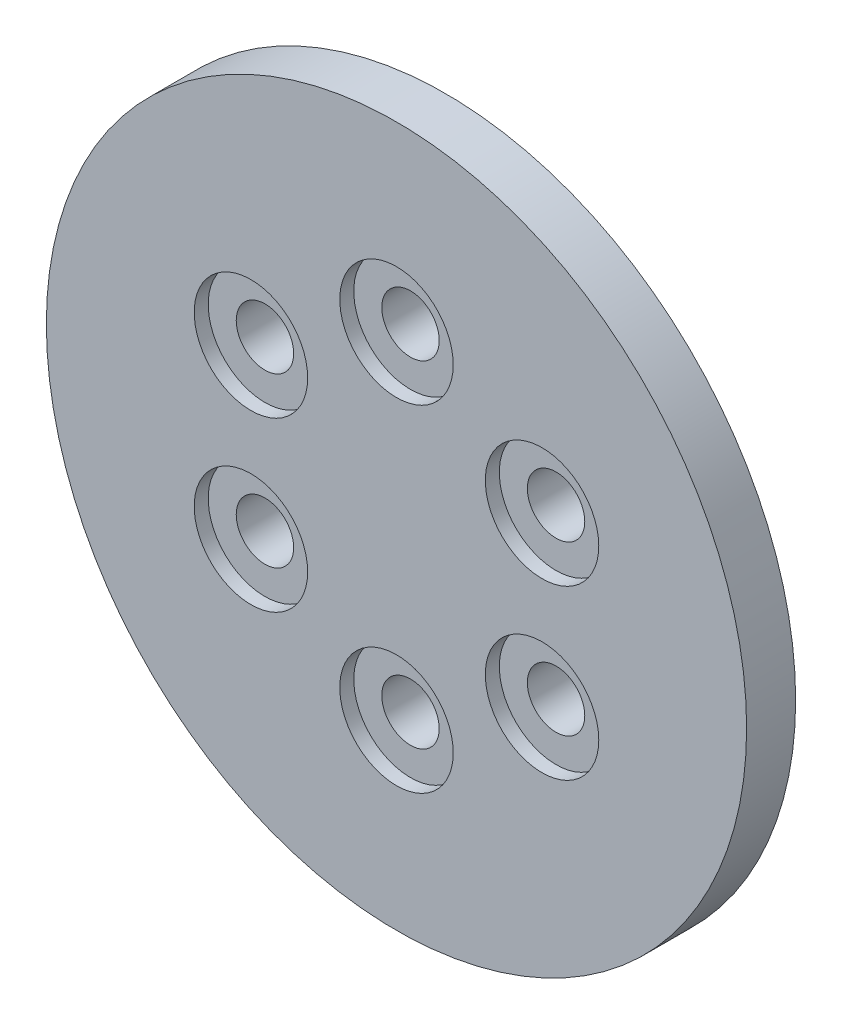
ISO-10303-21;
HEADER;
FILE_DESCRIPTION(('STEP AP214'),'2;1');
FILE_NAME('part.step','',(''),(''),'','','');
FILE_SCHEMA(('AUTOMOTIVE_DESIGN { 1 0 10303 214 1 1 1 1 }'));
ENDSEC;
DATA;
#1=APPLICATION_CONTEXT('core data for automotive mechanical design processes');
#2=APPLICATION_PROTOCOL_DEFINITION('international standard','automotive_design',2000,#1);
#3=PRODUCT_CONTEXT('',#1,'mechanical');
#4=PRODUCT('Part','Part','',(#3));
#5=PRODUCT_RELATED_PRODUCT_CATEGORY('part','',(#4));
#6=PRODUCT_DEFINITION_FORMATION('','',#4);
#7=PRODUCT_DEFINITION_CONTEXT('part definition',#1,'design');
#8=PRODUCT_DEFINITION('design','',#6,#7);
#9=PRODUCT_DEFINITION_SHAPE('','',#8);
#10=(LENGTH_UNIT() NAMED_UNIT(*) SI_UNIT(.MILLI.,.METRE.));
#11=(NAMED_UNIT(*) PLANE_ANGLE_UNIT() SI_UNIT($,.RADIAN.));
#12=(NAMED_UNIT(*) SI_UNIT($,.STERADIAN.) SOLID_ANGLE_UNIT());
#13=UNCERTAINTY_MEASURE_WITH_UNIT(LENGTH_MEASURE(1.E-05),#10,'distance_accuracy_value','');
#14=(GEOMETRIC_REPRESENTATION_CONTEXT(3) GLOBAL_UNCERTAINTY_ASSIGNED_CONTEXT((#13)) GLOBAL_UNIT_ASSIGNED_CONTEXT((#10,
#11,#12)) REPRESENTATION_CONTEXT('',''));
#15=CARTESIAN_POINT('',(0.,0.,0.));
#16=DIRECTION('',(0.,0.,1.));
#17=DIRECTION('',(1.,0.,0.));
#18=AXIS2_PLACEMENT_3D('',#15,#16,#17);
#19=CARTESIAN_POINT('',(0.,0.,4.));
#20=DIRECTION('',(0.,0.,-1.));
#21=DIRECTION('',(-1.,0.,0.));
#22=AXIS2_PLACEMENT_3D('',#19,#20,#21);
#23=CYLINDRICAL_SURFACE('',#22,25.);
#24=CARTESIAN_POINT('',(0.,0.,4.));
#25=DIRECTION('',(0.,0.,1.));
#26=DIRECTION('',(1.,0.,0.));
#27=AXIS2_PLACEMENT_3D('',#24,#25,#26);
#28=CIRCLE('',#27,25.);
#29=CARTESIAN_POINT('',(25.,0.,4.));
#30=VERTEX_POINT('',#29);
#31=EDGE_CURVE('E10',#30,#30,#28,.T.);
#32=ORIENTED_EDGE('',*,*,#31,.F.);
#33=EDGE_LOOP('',(#32));
#34=FACE_BOUND('',#33,.T.);
#35=CARTESIAN_POINT('',(0.,0.,0.5));
#36=DIRECTION('',(0.,0.,-1.));
#37=DIRECTION('',(-1.,0.,0.));
#38=AXIS2_PLACEMENT_3D('',#35,#36,#37);
#39=CIRCLE('',#38,25.);
#40=CARTESIAN_POINT('',(-25.,0.,0.5));
#41=VERTEX_POINT('',#40);
#42=EDGE_CURVE('E120',#41,#41,#39,.T.);
#43=ORIENTED_EDGE('',*,*,#42,.F.);
#44=EDGE_LOOP('',(#43));
#45=FACE_BOUND('',#44,.T.);
#46=ADVANCED_FACE('F38',(#34,#45),#23,.T.);
#47=CARTESIAN_POINT('',(0.,0.,0.));
#48=DIRECTION('',(0.,0.,1.));
#49=DIRECTION('',(1.,0.,0.));
#50=AXIS2_PLACEMENT_3D('',#47,#48,#49);
#51=PLANE('',#50);
#52=CARTESIAN_POINT('',(10.3923048454122,-6.00000000000059,0.));
#53=DIRECTION('',(0.,0.,-1.));
#54=DIRECTION('',(-1.,0.,0.));
#55=AXIS2_PLACEMENT_3D('',#52,#53,#54);
#56=CIRCLE('',#55,2.05000000000126);
#57=CARTESIAN_POINT('',(8.34230484541099,-6.00000000000059,0.));
#58=VERTEX_POINT('',#57);
#59=EDGE_CURVE('E44',#58,#58,#56,.T.);
#60=ORIENTED_EDGE('',*,*,#59,.F.);
#61=EDGE_LOOP('',(#60));
#62=FACE_BOUND('',#61,.T.);
#63=CARTESIAN_POINT('',(10.3923048454129,5.9999999999994,0.));
#64=DIRECTION('',(0.,0.,-1.));
#65=DIRECTION('',(-1.,0.,0.));
#66=AXIS2_PLACEMENT_3D('',#63,#64,#65);
#67=CIRCLE('',#66,2.05000000000064);
#68=CARTESIAN_POINT('',(8.34230484541229,5.9999999999994,0.));
#69=VERTEX_POINT('',#68);
#70=EDGE_CURVE('E48',#69,#69,#67,.T.);
#71=ORIENTED_EDGE('',*,*,#70,.F.);
#72=EDGE_LOOP('',(#71));
#73=FACE_BOUND('',#72,.T.);
#74=CARTESIAN_POINT('',(0.,12.,0.));
#75=DIRECTION('',(0.,0.,-1.));
#76=DIRECTION('',(-1.,0.,0.));
#77=AXIS2_PLACEMENT_3D('',#74,#75,#76);
#78=CIRCLE('',#77,2.05);
#79=CARTESIAN_POINT('',(-2.05,12.,0.));
#80=VERTEX_POINT('',#79);
#81=EDGE_CURVE('E52',#80,#80,#78,.T.);
#82=ORIENTED_EDGE('',*,*,#81,.F.);
#83=EDGE_LOOP('',(#82));
#84=FACE_BOUND('',#83,.T.);
#85=CARTESIAN_POINT('',(-10.3923048454136,6.00000000000059,0.));
#86=DIRECTION('',(0.,0.,-1.));
#87=DIRECTION('',(-1.,0.,0.));
#88=AXIS2_PLACEMENT_3D('',#85,#86,#87);
#89=CIRCLE('',#88,2.05000000000019);
#90=CARTESIAN_POINT('',(-12.4423048454138,6.00000000000059,0.));
#91=VERTEX_POINT('',#90);
#92=EDGE_CURVE('E62',#91,#91,#89,.T.);
#93=ORIENTED_EDGE('',*,*,#92,.F.);
#94=EDGE_LOOP('',(#93));
#95=FACE_BOUND('',#94,.T.);
#96=CARTESIAN_POINT('',(-10.3923048454143,-5.99999999999941,0.));
#97=DIRECTION('',(0.,0.,-1.));
#98=DIRECTION('',(-1.,0.,0.));
#99=AXIS2_PLACEMENT_3D('',#96,#97,#98);
#100=CIRCLE('',#99,2.05000000000086);
#101=CARTESIAN_POINT('',(-12.4423048454151,-5.99999999999941,0.));
#102=VERTEX_POINT('',#101);
#103=EDGE_CURVE('E58',#102,#102,#100,.T.);
#104=ORIENTED_EDGE('',*,*,#103,.F.);
#105=EDGE_LOOP('',(#104));
#106=FACE_BOUND('',#105,.T.);
#107=CARTESIAN_POINT('',(-1.35983332418246E-12,-12.,0.));
#108=DIRECTION('',(0.,0.,-1.));
#109=DIRECTION('',(-1.,0.,0.));
#110=AXIS2_PLACEMENT_3D('',#107,#108,#109);
#111=CIRCLE('',#110,2.05000000000138);
#112=CARTESIAN_POINT('',(-2.05000000000274,-12.,0.));
#113=VERTEX_POINT('',#112);
#114=EDGE_CURVE('E55',#113,#113,#111,.T.);
#115=ORIENTED_EDGE('',*,*,#114,.F.);
#116=EDGE_LOOP('',(#115));
#117=FACE_BOUND('',#116,.T.);
#118=CARTESIAN_POINT('',(0.,0.,0.));
#119=DIRECTION('',(0.,0.,-1.));
#120=DIRECTION('',(-1.,0.,0.));
#121=AXIS2_PLACEMENT_3D('',#118,#119,#120);
#122=CIRCLE('',#121,20.);
#123=CARTESIAN_POINT('',(-20.,0.,0.));
#124=VERTEX_POINT('',#123);
#125=EDGE_CURVE('E124',#124,#124,#122,.T.);
#126=ORIENTED_EDGE('',*,*,#125,.T.);
#127=EDGE_LOOP('',(#126));
#128=FACE_BOUND('',#127,.T.);
#129=ADVANCED_FACE('F141',(#62,#73,#84,#95,#106,#117,#128),#51,.F.);
#130=CARTESIAN_POINT('',(10.3923048454122,-6.00000000000059,10.));
#131=DIRECTION('',(0.,0.,-1.));
#132=DIRECTION('',(-1.,0.,0.));
#133=AXIS2_PLACEMENT_3D('',#130,#131,#132);
#134=CYLINDRICAL_SURFACE('',#133,2.05000000000126);
#135=ORIENTED_EDGE('',*,*,#59,.T.);
#136=EDGE_LOOP('',(#135));
#137=FACE_BOUND('',#136,.T.);
#138=CARTESIAN_POINT('',(10.3923048454122,-6.00000000000059,3.));
#139=DIRECTION('',(0.,0.,1.));
#140=DIRECTION('',(1.,0.,0.));
#141=AXIS2_PLACEMENT_3D('',#138,#139,#140);
#142=CIRCLE('',#141,2.05000000000126);
#143=CARTESIAN_POINT('',(12.4423048454135,-6.00000000000059,3.));
#144=VERTEX_POINT('',#143);
#145=EDGE_CURVE('E83',#144,#144,#142,.T.);
#146=ORIENTED_EDGE('',*,*,#145,.T.);
#147=EDGE_LOOP('',(#146));
#148=FACE_BOUND('',#147,.T.);
#149=ADVANCED_FACE('F146',(#137,#148),#134,.F.);
#150=CARTESIAN_POINT('',(10.3923048454129,5.9999999999994,10.));
#151=DIRECTION('',(0.,0.,-1.));
#152=DIRECTION('',(-1.,0.,0.));
#153=AXIS2_PLACEMENT_3D('',#150,#151,#152);
#154=CYLINDRICAL_SURFACE('',#153,2.05000000000064);
#155=ORIENTED_EDGE('',*,*,#70,.T.);
#156=EDGE_LOOP('',(#155));
#157=FACE_BOUND('',#156,.T.);
#158=CARTESIAN_POINT('',(10.3923048454129,5.9999999999994,3.));
#159=DIRECTION('',(0.,0.,1.));
#160=DIRECTION('',(1.,0.,0.));
#161=AXIS2_PLACEMENT_3D('',#158,#159,#160);
#162=CIRCLE('',#161,2.05000000000064);
#163=CARTESIAN_POINT('',(12.4423048454136,5.9999999999994,3.));
#164=VERTEX_POINT('',#163);
#165=EDGE_CURVE('E80',#164,#164,#162,.T.);
#166=ORIENTED_EDGE('',*,*,#165,.T.);
#167=EDGE_LOOP('',(#166));
#168=FACE_BOUND('',#167,.T.);
#169=ADVANCED_FACE('F151',(#157,#168),#154,.F.);
#170=CARTESIAN_POINT('',(0.,12.,10.));
#171=DIRECTION('',(0.,0.,-1.));
#172=DIRECTION('',(-1.,0.,0.));
#173=AXIS2_PLACEMENT_3D('',#170,#171,#172);
#174=CYLINDRICAL_SURFACE('',#173,2.05);
#175=ORIENTED_EDGE('',*,*,#81,.T.);
#176=EDGE_LOOP('',(#175));
#177=FACE_BOUND('',#176,.T.);
#178=CARTESIAN_POINT('',(0.,12.,3.));
#179=DIRECTION('',(0.,0.,1.));
#180=DIRECTION('',(1.,0.,0.));
#181=AXIS2_PLACEMENT_3D('',#178,#179,#180);
#182=CIRCLE('',#181,2.05);
#183=CARTESIAN_POINT('',(2.05,12.,3.));
#184=VERTEX_POINT('',#183);
#185=EDGE_CURVE('E115',#184,#184,#182,.T.);
#186=ORIENTED_EDGE('',*,*,#185,.T.);
#187=EDGE_LOOP('',(#186));
#188=FACE_BOUND('',#187,.T.);
#189=ADVANCED_FACE('F171',(#177,#188),#174,.F.);
#190=CARTESIAN_POINT('',(-10.3923048454136,6.00000000000059,10.));
#191=DIRECTION('',(0.,0.,-1.));
#192=DIRECTION('',(-1.,0.,0.));
#193=AXIS2_PLACEMENT_3D('',#190,#191,#192);
#194=CYLINDRICAL_SURFACE('',#193,2.05000000000019);
#195=ORIENTED_EDGE('',*,*,#92,.T.);
#196=EDGE_LOOP('',(#195));
#197=FACE_BOUND('',#196,.T.);
#198=CARTESIAN_POINT('',(-10.3923048454136,6.00000000000059,3.));
#199=DIRECTION('',(0.,0.,1.));
#200=DIRECTION('',(1.,0.,0.));
#201=AXIS2_PLACEMENT_3D('',#198,#199,#200);
#202=CIRCLE('',#201,2.05000000000019);
#203=CARTESIAN_POINT('',(-8.34230484541342,6.00000000000059,3.));
#204=VERTEX_POINT('',#203);
#205=EDGE_CURVE('E70',#204,#204,#202,.T.);
#206=ORIENTED_EDGE('',*,*,#205,.T.);
#207=EDGE_LOOP('',(#206));
#208=FACE_BOUND('',#207,.T.);
#209=ADVANCED_FACE('F167',(#197,#208),#194,.F.);
#210=CARTESIAN_POINT('',(-10.3923048454143,-5.99999999999941,10.));
#211=DIRECTION('',(0.,0.,-1.));
#212=DIRECTION('',(-1.,0.,0.));
#213=AXIS2_PLACEMENT_3D('',#210,#211,#212);
#214=CYLINDRICAL_SURFACE('',#213,2.05000000000086);
#215=ORIENTED_EDGE('',*,*,#103,.T.);
#216=EDGE_LOOP('',(#215));
#217=FACE_BOUND('',#216,.T.);
#218=CARTESIAN_POINT('',(-10.3923048454143,-5.99999999999941,3.));
#219=DIRECTION('',(0.,0.,1.));
#220=DIRECTION('',(1.,0.,0.));
#221=AXIS2_PLACEMENT_3D('',#218,#219,#220);
#222=CIRCLE('',#221,2.05000000000086);
#223=CARTESIAN_POINT('',(-8.34230484541343,-5.99999999999941,3.));
#224=VERTEX_POINT('',#223);
#225=EDGE_CURVE('E102',#224,#224,#222,.T.);
#226=ORIENTED_EDGE('',*,*,#225,.T.);
#227=EDGE_LOOP('',(#226));
#228=FACE_BOUND('',#227,.T.);
#229=ADVANCED_FACE('F163',(#217,#228),#214,.F.);
#230=CARTESIAN_POINT('',(-1.35983332418246E-12,-12.,10.));
#231=DIRECTION('',(0.,0.,-1.));
#232=DIRECTION('',(-1.,0.,0.));
#233=AXIS2_PLACEMENT_3D('',#230,#231,#232);
#234=CYLINDRICAL_SURFACE('',#233,2.05000000000138);
#235=ORIENTED_EDGE('',*,*,#114,.T.);
#236=EDGE_LOOP('',(#235));
#237=FACE_BOUND('',#236,.T.);
#238=CARTESIAN_POINT('',(-1.35983332418246E-12,-12.,3.));
#239=DIRECTION('',(0.,0.,1.));
#240=DIRECTION('',(1.,0.,0.));
#241=AXIS2_PLACEMENT_3D('',#238,#239,#240);
#242=CIRCLE('',#241,2.05000000000138);
#243=CARTESIAN_POINT('',(2.05000000000002,-12.,3.));
#244=VERTEX_POINT('',#243);
#245=EDGE_CURVE('E93',#244,#244,#242,.T.);
#246=ORIENTED_EDGE('',*,*,#245,.T.);
#247=EDGE_LOOP('',(#246));
#248=FACE_BOUND('',#247,.T.);
#249=ADVANCED_FACE('F158',(#237,#248),#234,.F.);
#250=CARTESIAN_POINT('',(0.,0.,4.));
#251=DIRECTION('',(0.,0.,1.));
#252=DIRECTION('',(1.,0.,0.));
#253=AXIS2_PLACEMENT_3D('',#250,#251,#252);
#254=PLANE('',#253);
#255=CARTESIAN_POINT('',(-10.3923048454143,-5.99999999999941,4.));
#256=DIRECTION('',(0.,0.,1.));
#257=DIRECTION('',(1.,0.,0.));
#258=AXIS2_PLACEMENT_3D('',#255,#256,#257);
#259=CIRCLE('',#258,4.05000000000086);
#260=CARTESIAN_POINT('',(-6.34230484541343,-5.99999999999941,4.));
#261=VERTEX_POINT('',#260);
#262=EDGE_CURVE('E105',#261,#261,#259,.T.);
#263=ORIENTED_EDGE('',*,*,#262,.F.);
#264=EDGE_LOOP('',(#263));
#265=FACE_BOUND('',#264,.T.);
#266=CARTESIAN_POINT('',(-1.35983332418246E-12,-12.,4.));
#267=DIRECTION('',(0.,0.,1.));
#268=DIRECTION('',(1.,0.,0.));
#269=AXIS2_PLACEMENT_3D('',#266,#267,#268);
#270=CIRCLE('',#269,4.05000000000138);
#271=CARTESIAN_POINT('',(4.05000000000002,-12.,4.));
#272=VERTEX_POINT('',#271);
#273=EDGE_CURVE('E96',#272,#272,#270,.T.);
#274=ORIENTED_EDGE('',*,*,#273,.F.);
#275=EDGE_LOOP('',(#274));
#276=FACE_BOUND('',#275,.T.);
#277=CARTESIAN_POINT('',(10.3923048454122,-6.00000000000059,4.));
#278=DIRECTION('',(0.,0.,1.));
#279=DIRECTION('',(1.,0.,0.));
#280=AXIS2_PLACEMENT_3D('',#277,#278,#279);
#281=CIRCLE('',#280,4.05000000000126);
#282=CARTESIAN_POINT('',(14.4423048454135,-6.00000000000059,4.));
#283=VERTEX_POINT('',#282);
#284=EDGE_CURVE('E87',#283,#283,#281,.T.);
#285=ORIENTED_EDGE('',*,*,#284,.F.);
#286=EDGE_LOOP('',(#285));
#287=FACE_BOUND('',#286,.T.);
#288=CARTESIAN_POINT('',(10.3923048454129,5.9999999999994,4.));
#289=DIRECTION('',(0.,0.,1.));
#290=DIRECTION('',(1.,0.,0.));
#291=AXIS2_PLACEMENT_3D('',#288,#289,#290);
#292=CIRCLE('',#291,4.05000000000064);
#293=CARTESIAN_POINT('',(14.4423048454136,5.9999999999994,4.));
#294=VERTEX_POINT('',#293);
#295=EDGE_CURVE('E76',#294,#294,#292,.T.);
#296=ORIENTED_EDGE('',*,*,#295,.F.);
#297=EDGE_LOOP('',(#296));
#298=FACE_BOUND('',#297,.T.);
#299=CARTESIAN_POINT('',(0.,12.,4.));
#300=DIRECTION('',(0.,0.,1.));
#301=DIRECTION('',(1.,0.,0.));
#302=AXIS2_PLACEMENT_3D('',#299,#300,#301);
#303=CIRCLE('',#302,4.05);
#304=CARTESIAN_POINT('',(4.05,12.,4.));
#305=VERTEX_POINT('',#304);
#306=EDGE_CURVE('E112',#305,#305,#303,.T.);
#307=ORIENTED_EDGE('',*,*,#306,.F.);
#308=EDGE_LOOP('',(#307));
#309=FACE_BOUND('',#308,.T.);
#310=CARTESIAN_POINT('',(-10.3923048454136,6.00000000000059,4.));
#311=DIRECTION('',(0.,0.,1.));
#312=DIRECTION('',(1.,0.,0.));
#313=AXIS2_PLACEMENT_3D('',#310,#311,#312);
#314=CIRCLE('',#313,4.05000000000019);
#315=CARTESIAN_POINT('',(-6.34230484541342,6.00000000000059,4.));
#316=VERTEX_POINT('',#315);
#317=EDGE_CURVE('E67',#316,#316,#314,.T.);
#318=ORIENTED_EDGE('',*,*,#317,.F.);
#319=EDGE_LOOP('',(#318));
#320=FACE_BOUND('',#319,.T.);
#321=ORIENTED_EDGE('',*,*,#31,.T.);
#322=EDGE_LOOP('',(#321));
#323=FACE_BOUND('',#322,.T.);
#324=ADVANCED_FACE('F155',(#265,#276,#287,#298,#309,#320,#323),#254,.T.);
#325=CARTESIAN_POINT('',(-1.35983332418246E-12,-12.,3.));
#326=DIRECTION('',(0.,0.,1.));
#327=DIRECTION('',(1.,0.,0.));
#328=AXIS2_PLACEMENT_3D('',#325,#326,#327);
#329=CYLINDRICAL_SURFACE('',#328,4.05000000000138);
#330=CARTESIAN_POINT('',(-1.35983332418246E-12,-12.,3.));
#331=DIRECTION('',(0.,0.,1.));
#332=DIRECTION('',(1.,0.,0.));
#333=AXIS2_PLACEMENT_3D('',#330,#331,#332);
#334=CIRCLE('',#333,4.05000000000138);
#335=CARTESIAN_POINT('',(4.05000000000002,-12.,3.));
#336=VERTEX_POINT('',#335);
#337=EDGE_CURVE('E99',#336,#336,#334,.T.);
#338=ORIENTED_EDGE('',*,*,#337,.F.);
#339=EDGE_LOOP('',(#338));
#340=FACE_BOUND('',#339,.T.);
#341=ORIENTED_EDGE('',*,*,#273,.T.);
#342=EDGE_LOOP('',(#341));
#343=FACE_BOUND('',#342,.T.);
#344=ADVANCED_FACE('F157',(#340,#343),#329,.F.);
#345=CARTESIAN_POINT('',(-1.35983332418246E-12,-12.,3.));
#346=DIRECTION('',(0.,0.,1.));
#347=DIRECTION('',(1.,0.,0.));
#348=AXIS2_PLACEMENT_3D('',#345,#346,#347);
#349=PLANE('',#348);
#350=ORIENTED_EDGE('',*,*,#245,.F.);
#351=EDGE_LOOP('',(#350));
#352=FACE_BOUND('',#351,.T.);
#353=ORIENTED_EDGE('',*,*,#337,.T.);
#354=EDGE_LOOP('',(#353));
#355=FACE_BOUND('',#354,.T.);
#356=ADVANCED_FACE('F207',(#352,#355),#349,.T.);
#357=CARTESIAN_POINT('',(-10.3923048454143,-5.99999999999941,3.));
#358=DIRECTION('',(0.,0.,1.));
#359=DIRECTION('',(1.,0.,0.));
#360=AXIS2_PLACEMENT_3D('',#357,#358,#359);
#361=CYLINDRICAL_SURFACE('',#360,4.05000000000086);
#362=CARTESIAN_POINT('',(-10.3923048454143,-5.99999999999941,3.));
#363=DIRECTION('',(0.,0.,1.));
#364=DIRECTION('',(1.,0.,0.));
#365=AXIS2_PLACEMENT_3D('',#362,#363,#364);
#366=CIRCLE('',#365,4.05000000000086);
#367=CARTESIAN_POINT('',(-6.34230484541343,-5.99999999999941,3.));
#368=VERTEX_POINT('',#367);
#369=EDGE_CURVE('E75',#368,#368,#366,.T.);
#370=ORIENTED_EDGE('',*,*,#369,.F.);
#371=EDGE_LOOP('',(#370));
#372=FACE_BOUND('',#371,.T.);
#373=ORIENTED_EDGE('',*,*,#262,.T.);
#374=EDGE_LOOP('',(#373));
#375=FACE_BOUND('',#374,.T.);
#376=ADVANCED_FACE('F211',(#372,#375),#361,.F.);
#377=CARTESIAN_POINT('',(-10.3923048454143,-5.99999999999941,3.));
#378=DIRECTION('',(0.,0.,1.));
#379=DIRECTION('',(1.,0.,0.));
#380=AXIS2_PLACEMENT_3D('',#377,#378,#379);
#381=PLANE('',#380);
#382=ORIENTED_EDGE('',*,*,#225,.F.);
#383=EDGE_LOOP('',(#382));
#384=FACE_BOUND('',#383,.T.);
#385=ORIENTED_EDGE('',*,*,#369,.T.);
#386=EDGE_LOOP('',(#385));
#387=FACE_BOUND('',#386,.T.);
#388=ADVANCED_FACE('F183',(#384,#387),#381,.T.);
#389=CARTESIAN_POINT('',(-10.3923048454136,6.00000000000059,3.));
#390=DIRECTION('',(0.,0.,1.));
#391=DIRECTION('',(1.,0.,0.));
#392=AXIS2_PLACEMENT_3D('',#389,#390,#391);
#393=CYLINDRICAL_SURFACE('',#392,4.05000000000019);
#394=CARTESIAN_POINT('',(-10.3923048454136,6.00000000000059,3.));
#395=DIRECTION('',(0.,0.,1.));
#396=DIRECTION('',(1.,0.,0.));
#397=AXIS2_PLACEMENT_3D('',#394,#395,#396);
#398=CIRCLE('',#397,4.05000000000019);
#399=CARTESIAN_POINT('',(-6.34230484541342,6.00000000000059,3.));
#400=VERTEX_POINT('',#399);
#401=EDGE_CURVE('E59',#400,#400,#398,.T.);
#402=ORIENTED_EDGE('',*,*,#401,.F.);
#403=EDGE_LOOP('',(#402));
#404=FACE_BOUND('',#403,.T.);
#405=ORIENTED_EDGE('',*,*,#317,.T.);
#406=EDGE_LOOP('',(#405));
#407=FACE_BOUND('',#406,.T.);
#408=ADVANCED_FACE('F179',(#404,#407),#393,.F.);
#409=CARTESIAN_POINT('',(-10.3923048454136,6.00000000000059,3.));
#410=DIRECTION('',(0.,0.,1.));
#411=DIRECTION('',(1.,0.,0.));
#412=AXIS2_PLACEMENT_3D('',#409,#410,#411);
#413=PLANE('',#412);
#414=ORIENTED_EDGE('',*,*,#205,.F.);
#415=EDGE_LOOP('',(#414));
#416=FACE_BOUND('',#415,.T.);
#417=ORIENTED_EDGE('',*,*,#401,.T.);
#418=EDGE_LOOP('',(#417));
#419=FACE_BOUND('',#418,.T.);
#420=ADVANCED_FACE('F182',(#416,#419),#413,.T.);
#421=CARTESIAN_POINT('',(0.,12.,3.));
#422=DIRECTION('',(0.,0.,1.));
#423=DIRECTION('',(1.,0.,0.));
#424=AXIS2_PLACEMENT_3D('',#421,#422,#423);
#425=CYLINDRICAL_SURFACE('',#424,4.05);
#426=CARTESIAN_POINT('',(0.,12.,3.));
#427=DIRECTION('',(0.,0.,1.));
#428=DIRECTION('',(1.,0.,0.));
#429=AXIS2_PLACEMENT_3D('',#426,#427,#428);
#430=CIRCLE('',#429,4.05);
#431=CARTESIAN_POINT('',(4.05,12.,3.));
#432=VERTEX_POINT('',#431);
#433=EDGE_CURVE('E86',#432,#432,#430,.T.);
#434=ORIENTED_EDGE('',*,*,#433,.F.);
#435=EDGE_LOOP('',(#434));
#436=FACE_BOUND('',#435,.T.);
#437=ORIENTED_EDGE('',*,*,#306,.T.);
#438=EDGE_LOOP('',(#437));
#439=FACE_BOUND('',#438,.T.);
#440=ADVANCED_FACE('F187',(#436,#439),#425,.F.);
#441=CARTESIAN_POINT('',(0.,12.,3.));
#442=DIRECTION('',(0.,0.,1.));
#443=DIRECTION('',(1.,0.,0.));
#444=AXIS2_PLACEMENT_3D('',#441,#442,#443);
#445=PLANE('',#444);
#446=ORIENTED_EDGE('',*,*,#185,.F.);
#447=EDGE_LOOP('',(#446));
#448=FACE_BOUND('',#447,.T.);
#449=ORIENTED_EDGE('',*,*,#433,.T.);
#450=EDGE_LOOP('',(#449));
#451=FACE_BOUND('',#450,.T.);
#452=ADVANCED_FACE('F193',(#448,#451),#445,.T.);
#453=CARTESIAN_POINT('',(10.3923048454129,5.9999999999994,3.));
#454=DIRECTION('',(0.,0.,1.));
#455=DIRECTION('',(1.,0.,0.));
#456=AXIS2_PLACEMENT_3D('',#453,#454,#455);
#457=CYLINDRICAL_SURFACE('',#456,4.05000000000064);
#458=CARTESIAN_POINT('',(10.3923048454129,5.9999999999994,3.));
#459=DIRECTION('',(0.,0.,1.));
#460=DIRECTION('',(1.,0.,0.));
#461=AXIS2_PLACEMENT_3D('',#458,#459,#460);
#462=CIRCLE('',#461,4.05000000000064);
#463=CARTESIAN_POINT('',(14.4423048454136,5.9999999999994,3.));
#464=VERTEX_POINT('',#463);
#465=EDGE_CURVE('E79',#464,#464,#462,.T.);
#466=ORIENTED_EDGE('',*,*,#465,.F.);
#467=EDGE_LOOP('',(#466));
#468=FACE_BOUND('',#467,.T.);
#469=ORIENTED_EDGE('',*,*,#295,.T.);
#470=EDGE_LOOP('',(#469));
#471=FACE_BOUND('',#470,.T.);
#472=ADVANCED_FACE('F189',(#468,#471),#457,.F.);
#473=CARTESIAN_POINT('',(10.3923048454129,5.9999999999994,3.));
#474=DIRECTION('',(0.,0.,1.));
#475=DIRECTION('',(1.,0.,0.));
#476=AXIS2_PLACEMENT_3D('',#473,#474,#475);
#477=PLANE('',#476);
#478=ORIENTED_EDGE('',*,*,#165,.F.);
#479=EDGE_LOOP('',(#478));
#480=FACE_BOUND('',#479,.T.);
#481=ORIENTED_EDGE('',*,*,#465,.T.);
#482=EDGE_LOOP('',(#481));
#483=FACE_BOUND('',#482,.T.);
#484=ADVANCED_FACE('F192',(#480,#483),#477,.T.);
#485=CARTESIAN_POINT('',(10.3923048454122,-6.00000000000059,3.));
#486=DIRECTION('',(0.,0.,1.));
#487=DIRECTION('',(1.,0.,0.));
#488=AXIS2_PLACEMENT_3D('',#485,#486,#487);
#489=CYLINDRICAL_SURFACE('',#488,4.05000000000126);
#490=CARTESIAN_POINT('',(10.3923048454122,-6.00000000000059,3.));
#491=DIRECTION('',(0.,0.,1.));
#492=DIRECTION('',(1.,0.,0.));
#493=AXIS2_PLACEMENT_3D('',#490,#491,#492);
#494=CIRCLE('',#493,4.05000000000126);
#495=CARTESIAN_POINT('',(14.4423048454135,-6.00000000000059,3.));
#496=VERTEX_POINT('',#495);
#497=EDGE_CURVE('E90',#496,#496,#494,.T.);
#498=ORIENTED_EDGE('',*,*,#497,.F.);
#499=EDGE_LOOP('',(#498));
#500=FACE_BOUND('',#499,.T.);
#501=ORIENTED_EDGE('',*,*,#284,.T.);
#502=EDGE_LOOP('',(#501));
#503=FACE_BOUND('',#502,.T.);
#504=ADVANCED_FACE('F197',(#500,#503),#489,.F.);
#505=CARTESIAN_POINT('',(10.3923048454122,-6.00000000000059,3.));
#506=DIRECTION('',(0.,0.,1.));
#507=DIRECTION('',(1.,0.,0.));
#508=AXIS2_PLACEMENT_3D('',#505,#506,#507);
#509=PLANE('',#508);
#510=ORIENTED_EDGE('',*,*,#145,.F.);
#511=EDGE_LOOP('',(#510));
#512=FACE_BOUND('',#511,.T.);
#513=ORIENTED_EDGE('',*,*,#497,.T.);
#514=EDGE_LOOP('',(#513));
#515=FACE_BOUND('',#514,.T.);
#516=ADVANCED_FACE('F136',(#512,#515),#509,.T.);
#517=CARTESIAN_POINT('',(0.,0.,0.5));
#518=DIRECTION('',(0.,0.,-1.));
#519=DIRECTION('',(-1.,0.,0.));
#520=AXIS2_PLACEMENT_3D('',#517,#518,#519);
#521=PLANE('',#520);
#522=CARTESIAN_POINT('',(0.,0.,0.5));
#523=DIRECTION('',(0.,0.,-1.));
#524=DIRECTION('',(-1.,0.,0.));
#525=AXIS2_PLACEMENT_3D('',#522,#523,#524);
#526=CIRCLE('',#525,20.);
#527=CARTESIAN_POINT('',(-20.,0.,0.5));
#528=VERTEX_POINT('',#527);
#529=EDGE_CURVE('E123',#528,#528,#526,.T.);
#530=ORIENTED_EDGE('',*,*,#529,.F.);
#531=EDGE_LOOP('',(#530));
#532=FACE_BOUND('',#531,.T.);
#533=ORIENTED_EDGE('',*,*,#42,.T.);
#534=EDGE_LOOP('',(#533));
#535=FACE_BOUND('',#534,.T.);
#536=ADVANCED_FACE('F133',(#532,#535),#521,.T.);
#537=CARTESIAN_POINT('',(0.,0.,0.5));
#538=DIRECTION('',(0.,0.,-1.));
#539=DIRECTION('',(-1.,0.,0.));
#540=AXIS2_PLACEMENT_3D('',#537,#538,#539);
#541=CYLINDRICAL_SURFACE('',#540,20.);
#542=ORIENTED_EDGE('',*,*,#529,.T.);
#543=EDGE_LOOP('',(#542));
#544=FACE_BOUND('',#543,.T.);
#545=ORIENTED_EDGE('',*,*,#125,.F.);
#546=EDGE_LOOP('',(#545));
#547=FACE_BOUND('',#546,.T.);
#548=ADVANCED_FACE('F130',(#544,#547),#541,.T.);
#549=CLOSED_SHELL('',(#46,#129,#149,#169,#189,#209,#229,#249,#324,#344,#356,#376,#388,#408,#420,
#440,#452,#472,#484,#504,#516,#536,#548));
#550=MANIFOLD_SOLID_BREP('B2',#549);
#551=ADVANCED_BREP_SHAPE_REPRESENTATION('',(#18,#550),#14);
#552=SHAPE_DEFINITION_REPRESENTATION(#9,#551);
ENDSEC;
END-ISO-10303-21;
